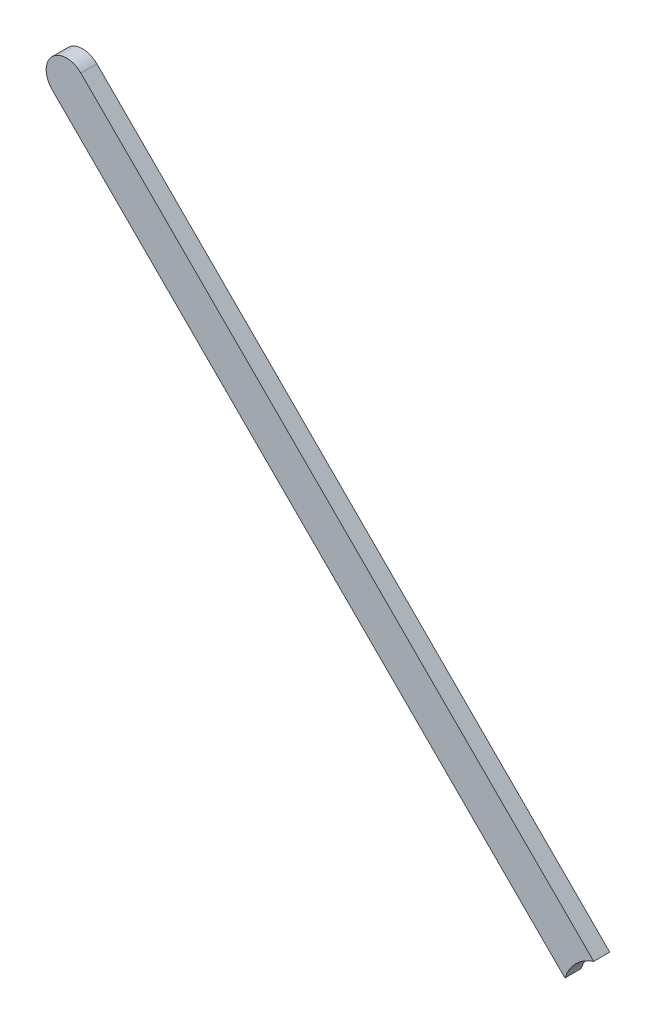
ISO-10303-21;
HEADER;
FILE_DESCRIPTION(('STEP AP214'),'2;1');
FILE_NAME('part.step','',(''),(''),'','','');
FILE_SCHEMA(('AUTOMOTIVE_DESIGN { 1 0 10303 214 1 1 1 1 }'));
ENDSEC;
DATA;
#1=APPLICATION_CONTEXT('core data for automotive mechanical design processes');
#2=APPLICATION_PROTOCOL_DEFINITION('international standard','automotive_design',2000,#1);
#3=PRODUCT_CONTEXT('',#1,'mechanical');
#4=PRODUCT('Part','Part','',(#3));
#5=PRODUCT_RELATED_PRODUCT_CATEGORY('part','',(#4));
#6=PRODUCT_DEFINITION_FORMATION('','',#4);
#7=PRODUCT_DEFINITION_CONTEXT('part definition',#1,'design');
#8=PRODUCT_DEFINITION('design','',#6,#7);
#9=PRODUCT_DEFINITION_SHAPE('','',#8);
#10=(LENGTH_UNIT() NAMED_UNIT(*) SI_UNIT(.MILLI.,.METRE.));
#11=(NAMED_UNIT(*) PLANE_ANGLE_UNIT() SI_UNIT($,.RADIAN.));
#12=(NAMED_UNIT(*) SI_UNIT($,.STERADIAN.) SOLID_ANGLE_UNIT());
#13=UNCERTAINTY_MEASURE_WITH_UNIT(LENGTH_MEASURE(1.E-05),#10,'distance_accuracy_value','');
#14=(GEOMETRIC_REPRESENTATION_CONTEXT(3) GLOBAL_UNCERTAINTY_ASSIGNED_CONTEXT((#13)) GLOBAL_UNIT_ASSIGNED_CONTEXT((#10,
#11,#12)) REPRESENTATION_CONTEXT('',''));
#15=CARTESIAN_POINT('',(0.,0.,0.));
#16=DIRECTION('',(0.,0.,1.));
#17=DIRECTION('',(1.,0.,0.));
#18=AXIS2_PLACEMENT_3D('',#15,#16,#17);
#19=CARTESIAN_POINT('',(122.09599406,100.1685322,0.));
#20=DIRECTION('',(0.707106781186546,0.707106781186549,0.));
#21=DIRECTION('',(0.707106781186549,-0.707106781186546,0.));
#22=AXIS2_PLACEMENT_3D('',#19,#20,#21);
#23=PLANE('',#22);
#24=DIRECTION('',(0.707106781186549,-0.707106781186546,0.));
#25=VECTOR('',#24,1.);
#26=CARTESIAN_POINT('',(122.09599406,100.1685322,0.1999996));
#27=LINE('',#26,#25);
#28=CARTESIAN_POINT('',(122.09599406,100.1685322,0.1999996));
#29=VERTEX_POINT('',#28);
#30=CARTESIAN_POINT('',(128.496197195153,93.7683290648469,0.1999996));
#31=VERTEX_POINT('',#30);
#32=EDGE_CURVE('E11',#29,#31,#27,.T.);
#33=ORIENTED_EDGE('',*,*,#32,.F.);
#34=DIRECTION('',(0.,0.,1.));
#35=VECTOR('',#34,1.);
#36=CARTESIAN_POINT('',(122.09599406,100.1685322,0.));
#37=LINE('',#36,#35);
#38=CARTESIAN_POINT('',(122.09599406,100.1685322,0.));
#39=VERTEX_POINT('',#38);
#40=EDGE_CURVE('E24',#39,#29,#37,.T.);
#41=ORIENTED_EDGE('',*,*,#40,.F.);
#42=DIRECTION('',(0.707106781186549,-0.707106781186546,0.));
#43=VECTOR('',#42,1.);
#44=CARTESIAN_POINT('',(122.09599406,100.1685322,0.));
#45=LINE('',#44,#43);
#46=CARTESIAN_POINT('',(128.496197195153,93.7683290648469,0.));
#47=VERTEX_POINT('',#46);
#48=EDGE_CURVE('E75',#39,#47,#45,.T.);
#49=ORIENTED_EDGE('',*,*,#48,.T.);
#50=DIRECTION('',(0.,0.,1.));
#51=VECTOR('',#50,1.);
#52=CARTESIAN_POINT('',(128.496197195153,93.7683290648469,0.));
#53=LINE('',#52,#51);
#54=EDGE_CURVE('E37',#47,#31,#53,.T.);
#55=ORIENTED_EDGE('',*,*,#54,.T.);
#56=EDGE_LOOP('',(#33,#41,#49,#55));
#57=FACE_BOUND('',#56,.T.);
#58=ADVANCED_FACE('F17',(#57),#23,.F.);
#59=CARTESIAN_POINT('',(129.0247356,93.599,0.));
#60=DIRECTION('',(0.,0.,-1.));
#61=DIRECTION('',(1.,0.,0.));
#62=AXIS2_PLACEMENT_3D('',#59,#60,#61);
#63=CYLINDRICAL_SURFACE('',#62,0.55500016);
#64=DIRECTION('',(0.,0.,1.));
#65=VECTOR('',#64,1.);
#66=CARTESIAN_POINT('',(128.855406535153,94.1275384048469,0.));
#67=LINE('',#66,#65);
#68=CARTESIAN_POINT('',(128.855406535153,94.1275384048469,0.));
#69=VERTEX_POINT('',#68);
#70=CARTESIAN_POINT('',(128.855406535153,94.1275384048469,0.1999996));
#71=VERTEX_POINT('',#70);
#72=EDGE_CURVE('E67',#69,#71,#67,.T.);
#73=ORIENTED_EDGE('',*,*,#72,.T.);
#74=CARTESIAN_POINT('',(129.0247356,93.599,0.1999996));
#75=DIRECTION('',(0.,0.,1.));
#76=DIRECTION('',(1.,0.,0.));
#77=AXIS2_PLACEMENT_3D('',#74,#75,#76);
#78=CIRCLE('',#77,0.55500016);
#79=EDGE_CURVE('E82',#71,#31,#78,.T.);
#80=ORIENTED_EDGE('',*,*,#79,.T.);
#81=ORIENTED_EDGE('',*,*,#54,.F.);
#82=CARTESIAN_POINT('',(129.0247356,93.599,0.));
#83=DIRECTION('',(0.,0.,1.));
#84=DIRECTION('',(1.,0.,0.));
#85=AXIS2_PLACEMENT_3D('',#82,#83,#84);
#86=CIRCLE('',#85,0.55500016);
#87=EDGE_CURVE('E80',#69,#47,#86,.T.);
#88=ORIENTED_EDGE('',*,*,#87,.F.);
#89=EDGE_LOOP('',(#73,#80,#81,#88));
#90=FACE_BOUND('',#89,.T.);
#91=ADVANCED_FACE('F88',(#90),#63,.F.);
#92=CARTESIAN_POINT('',(128.855406535153,94.1275384048469,0.));
#93=DIRECTION('',(-0.707106781186548,-0.707106781186548,0.));
#94=DIRECTION('',(-0.707106781186548,0.707106781186548,0.));
#95=AXIS2_PLACEMENT_3D('',#92,#93,#94);
#96=PLANE('',#95);
#97=DIRECTION('',(-0.707106781186548,0.707106781186548,0.));
#98=VECTOR('',#97,1.);
#99=CARTESIAN_POINT('',(129.20434154,93.7786034,0.1999996));
#100=LINE('',#99,#98);
#101=CARTESIAN_POINT('',(122.4552034,100.52774154,0.1999996));
#102=VERTEX_POINT('',#101);
#103=EDGE_CURVE('E71',#71,#102,#100,.T.);
#104=ORIENTED_EDGE('',*,*,#103,.F.);
#105=ORIENTED_EDGE('',*,*,#72,.F.);
#106=DIRECTION('',(-0.707106781186548,0.707106781186548,0.));
#107=VECTOR('',#106,1.);
#108=CARTESIAN_POINT('',(129.20434154,93.7786034,0.));
#109=LINE('',#108,#107);
#110=CARTESIAN_POINT('',(122.4552034,100.52774154,0.));
#111=VERTEX_POINT('',#110);
#112=EDGE_CURVE('E63',#69,#111,#109,.T.);
#113=ORIENTED_EDGE('',*,*,#112,.T.);
#114=DIRECTION('',(0.,0.,1.));
#115=VECTOR('',#114,1.);
#116=CARTESIAN_POINT('',(122.4552034,100.52774154,0.));
#117=LINE('',#116,#115);
#118=EDGE_CURVE('E53',#111,#102,#117,.T.);
#119=ORIENTED_EDGE('',*,*,#118,.T.);
#120=EDGE_LOOP('',(#104,#105,#113,#119));
#121=FACE_BOUND('',#120,.T.);
#122=ADVANCED_FACE('F66',(#121),#96,.F.);
#123=CARTESIAN_POINT('',(122.27559873,100.34813687,0.));
#124=DIRECTION('',(0.,0.,-1.));
#125=DIRECTION('',(0.707106781186576,0.70710678118652,0.));
#126=AXIS2_PLACEMENT_3D('',#123,#124,#125);
#127=CYLINDRICAL_SURFACE('',#126,0.253999360179552);
#128=CARTESIAN_POINT('',(122.27559873,100.34813687,0.1999996));
#129=DIRECTION('',(0.,0.,1.));
#130=DIRECTION('',(0.707106781186576,0.70710678118652,0.));
#131=AXIS2_PLACEMENT_3D('',#128,#129,#130);
#132=CIRCLE('',#131,0.253999360179552);
#133=EDGE_CURVE('E59',#102,#29,#132,.T.);
#134=ORIENTED_EDGE('',*,*,#133,.F.);
#135=ORIENTED_EDGE('',*,*,#118,.F.);
#136=CARTESIAN_POINT('',(122.27559873,100.34813687,0.));
#137=DIRECTION('',(0.,0.,1.));
#138=DIRECTION('',(0.707106781186576,0.70710678118652,0.));
#139=AXIS2_PLACEMENT_3D('',#136,#137,#138);
#140=CIRCLE('',#139,0.253999360179552);
#141=EDGE_CURVE('E57',#111,#39,#140,.T.);
#142=ORIENTED_EDGE('',*,*,#141,.T.);
#143=ORIENTED_EDGE('',*,*,#40,.T.);
#144=EDGE_LOOP('',(#134,#135,#142,#143));
#145=FACE_BOUND('',#144,.T.);
#146=ADVANCED_FACE('F55',(#145),#127,.T.);
#147=CARTESIAN_POINT('',(122.09599406,100.1685322,0.));
#148=DIRECTION('',(0.,0.,-1.));
#149=DIRECTION('',(-1.,0.,0.));
#150=AXIS2_PLACEMENT_3D('',#147,#148,#149);
#151=PLANE('',#150);
#152=ORIENTED_EDGE('',*,*,#48,.F.);
#153=ORIENTED_EDGE('',*,*,#141,.F.);
#154=ORIENTED_EDGE('',*,*,#112,.F.);
#155=ORIENTED_EDGE('',*,*,#87,.T.);
#156=EDGE_LOOP('',(#152,#153,#154,#155));
#157=FACE_BOUND('',#156,.T.);
#158=ADVANCED_FACE('F74',(#157),#151,.T.);
#159=CARTESIAN_POINT('',(122.09599406,100.1685322,0.1999996));
#160=DIRECTION('',(0.,0.,-1.));
#161=DIRECTION('',(-1.,0.,0.));
#162=AXIS2_PLACEMENT_3D('',#159,#160,#161);
#163=PLANE('',#162);
#164=ORIENTED_EDGE('',*,*,#133,.T.);
#165=ORIENTED_EDGE('',*,*,#32,.T.);
#166=ORIENTED_EDGE('',*,*,#79,.F.);
#167=ORIENTED_EDGE('',*,*,#103,.T.);
#168=EDGE_LOOP('',(#164,#165,#166,#167));
#169=FACE_BOUND('',#168,.T.);
#170=ADVANCED_FACE('F91',(#169),#163,.F.);
#171=CLOSED_SHELL('',(#58,#91,#122,#146,#158,#170));
#172=MANIFOLD_SOLID_BREP('B1',#171);
#173=ADVANCED_BREP_SHAPE_REPRESENTATION('',(#18,#172),#14);
#174=SHAPE_DEFINITION_REPRESENTATION(#9,#173);
ENDSEC;
END-ISO-10303-21;
